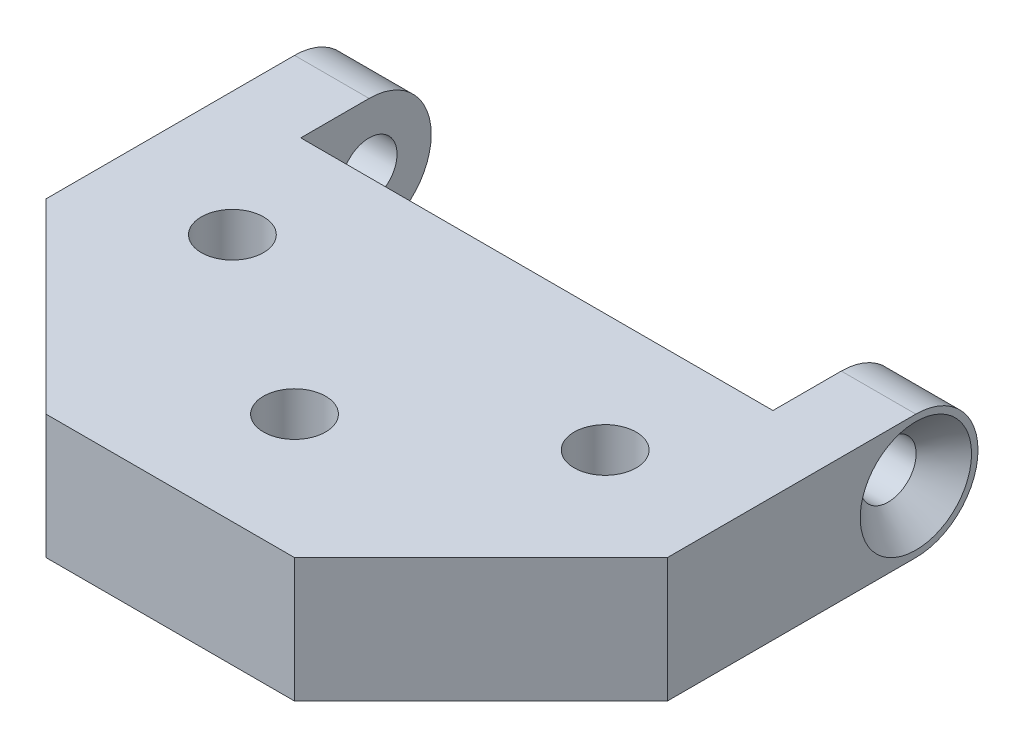
ISO-10303-21;
HEADER;
FILE_DESCRIPTION(('STEP AP214'),'2;1');
FILE_NAME('part.step','',(''),(''),'','','');
FILE_SCHEMA(('AUTOMOTIVE_DESIGN { 1 0 10303 214 1 1 1 1 }'));
ENDSEC;
DATA;
#1=APPLICATION_CONTEXT('core data for automotive mechanical design processes');
#2=APPLICATION_PROTOCOL_DEFINITION('international standard','automotive_design',2000,#1);
#3=PRODUCT_CONTEXT('',#1,'mechanical');
#4=PRODUCT('Part','Part','',(#3));
#5=PRODUCT_RELATED_PRODUCT_CATEGORY('part','',(#4));
#6=PRODUCT_DEFINITION_FORMATION('','',#4);
#7=PRODUCT_DEFINITION_CONTEXT('part definition',#1,'design');
#8=PRODUCT_DEFINITION('design','',#6,#7);
#9=PRODUCT_DEFINITION_SHAPE('','',#8);
#10=(LENGTH_UNIT() NAMED_UNIT(*) SI_UNIT(.MILLI.,.METRE.));
#11=(NAMED_UNIT(*) PLANE_ANGLE_UNIT() SI_UNIT($,.RADIAN.));
#12=(NAMED_UNIT(*) SI_UNIT($,.STERADIAN.) SOLID_ANGLE_UNIT());
#13=UNCERTAINTY_MEASURE_WITH_UNIT(LENGTH_MEASURE(1.E-05),#10,'distance_accuracy_value','');
#14=(GEOMETRIC_REPRESENTATION_CONTEXT(3) GLOBAL_UNCERTAINTY_ASSIGNED_CONTEXT((#13)) GLOBAL_UNIT_ASSIGNED_CONTEXT((#10,
#11,#12)) REPRESENTATION_CONTEXT('',''));
#15=CARTESIAN_POINT('',(0.,0.,0.));
#16=DIRECTION('',(0.,0.,1.));
#17=DIRECTION('',(1.,0.,0.));
#18=AXIS2_PLACEMENT_3D('',#15,#16,#17);
#19=CARTESIAN_POINT('',(19.,10.,0.));
#20=DIRECTION('',(-1.,0.,0.));
#21=DIRECTION('',(0.,0.,1.));
#22=AXIS2_PLACEMENT_3D('',#19,#20,#21);
#23=PLANE('',#22);
#24=CARTESIAN_POINT('',(19.,5.,-15.));
#25=DIRECTION('',(-1.,0.,0.));
#26=DIRECTION('',(0.,0.,1.));
#27=AXIS2_PLACEMENT_3D('',#24,#25,#26);
#28=CIRCLE('',#27,2.24999999999999);
#29=CARTESIAN_POINT('',(19.,5.,-12.75));
#30=VERTEX_POINT('',#29);
#31=EDGE_CURVE('E243',#30,#30,#28,.T.);
#32=ORIENTED_EDGE('',*,*,#31,.F.);
#33=EDGE_LOOP('',(#32));
#34=FACE_BOUND('',#33,.T.);
#35=DIRECTION('',(0.,0.,-1.));
#36=VECTOR('',#35,1.);
#37=CARTESIAN_POINT('',(19.,10.,0.));
#38=LINE('',#37,#36);
#39=CARTESIAN_POINT('',(19.,10.,-9.5));
#40=VERTEX_POINT('',#39);
#41=CARTESIAN_POINT('',(19.,10.,-15.));
#42=VERTEX_POINT('',#41);
#43=EDGE_CURVE('E136',#40,#42,#38,.T.);
#44=ORIENTED_EDGE('',*,*,#43,.T.);
#45=CARTESIAN_POINT('',(19.,5.,-15.));
#46=DIRECTION('',(-1.,0.,0.));
#47=DIRECTION('',(0.,0.,1.));
#48=AXIS2_PLACEMENT_3D('',#45,#46,#47);
#49=CIRCLE('',#48,5.);
#50=CARTESIAN_POINT('',(19.,5.,-20.));
#51=VERTEX_POINT('',#50);
#52=EDGE_CURVE('E211',#42,#51,#49,.T.);
#53=ORIENTED_EDGE('',*,*,#52,.T.);
#54=CARTESIAN_POINT('',(19.,5.,-15.));
#55=DIRECTION('',(-1.,0.,0.));
#56=DIRECTION('',(0.,0.,1.));
#57=AXIS2_PLACEMENT_3D('',#54,#55,#56);
#58=CIRCLE('',#57,5.);
#59=CARTESIAN_POINT('',(19.,0.,-15.));
#60=VERTEX_POINT('',#59);
#61=EDGE_CURVE('E208',#51,#60,#58,.T.);
#62=ORIENTED_EDGE('',*,*,#61,.T.);
#63=DIRECTION('',(0.,0.,-1.));
#64=VECTOR('',#63,1.);
#65=CARTESIAN_POINT('',(19.,0.,0.));
#66=LINE('',#65,#64);
#67=CARTESIAN_POINT('',(19.,0.,-9.5));
#68=VERTEX_POINT('',#67);
#69=EDGE_CURVE('E138',#68,#60,#66,.T.);
#70=ORIENTED_EDGE('',*,*,#69,.F.);
#71=DIRECTION('',(0.,-1.,0.));
#72=VECTOR('',#71,1.);
#73=CARTESIAN_POINT('',(19.,10.,-9.5));
#74=LINE('',#73,#72);
#75=EDGE_CURVE('E134',#40,#68,#74,.T.);
#76=ORIENTED_EDGE('',*,*,#75,.F.);
#77=EDGE_LOOP('',(#44,#53,#62,#70,#76));
#78=FACE_BOUND('',#77,.T.);
#79=ADVANCED_FACE('F41',(#34,#78),#23,.T.);
#80=CARTESIAN_POINT('',(0.,10.,-9.5));
#81=DIRECTION('',(0.,0.,-1.));
#82=DIRECTION('',(-1.,0.,0.));
#83=AXIS2_PLACEMENT_3D('',#80,#81,#82);
#84=PLANE('',#83);
#85=DIRECTION('',(1.,0.,0.));
#86=VECTOR('',#85,1.);
#87=CARTESIAN_POINT('',(0.,0.,-9.5));
#88=LINE('',#87,#86);
#89=CARTESIAN_POINT('',(-19.,0.,-9.5));
#90=VERTEX_POINT('',#89);
#91=EDGE_CURVE('E177',#90,#68,#88,.T.);
#92=ORIENTED_EDGE('',*,*,#91,.F.);
#93=DIRECTION('',(0.,-1.,0.));
#94=VECTOR('',#93,1.);
#95=CARTESIAN_POINT('',(-19.,10.,-9.5));
#96=LINE('',#95,#94);
#97=CARTESIAN_POINT('',(-19.,10.,-9.5));
#98=VERTEX_POINT('',#97);
#99=EDGE_CURVE('E145',#98,#90,#96,.T.);
#100=ORIENTED_EDGE('',*,*,#99,.F.);
#101=DIRECTION('',(1.,0.,0.));
#102=VECTOR('',#101,1.);
#103=CARTESIAN_POINT('',(0.,10.,-9.5));
#104=LINE('',#103,#102);
#105=EDGE_CURVE('E151',#98,#40,#104,.T.);
#106=ORIENTED_EDGE('',*,*,#105,.T.);
#107=ORIENTED_EDGE('',*,*,#75,.T.);
#108=EDGE_LOOP('',(#92,#100,#106,#107));
#109=FACE_BOUND('',#108,.T.);
#110=ADVANCED_FACE('F157',(#109),#84,.T.);
#111=CARTESIAN_POINT('',(-19.,10.,0.));
#112=DIRECTION('',(-1.,0.,0.));
#113=DIRECTION('',(0.,0.,1.));
#114=AXIS2_PLACEMENT_3D('',#111,#112,#113);
#115=PLANE('',#114);
#116=CARTESIAN_POINT('',(-19.,5.,-15.));
#117=DIRECTION('',(-1.,0.,0.));
#118=DIRECTION('',(0.,0.,1.));
#119=AXIS2_PLACEMENT_3D('',#116,#117,#118);
#120=CIRCLE('',#119,2.24999999999999);
#121=CARTESIAN_POINT('',(-19.,5.,-12.75));
#122=VERTEX_POINT('',#121);
#123=EDGE_CURVE('E248',#122,#122,#120,.T.);
#124=ORIENTED_EDGE('',*,*,#123,.T.);
#125=EDGE_LOOP('',(#124));
#126=FACE_BOUND('',#125,.T.);
#127=DIRECTION('',(0.,0.,-1.));
#128=VECTOR('',#127,1.);
#129=CARTESIAN_POINT('',(-19.,0.,0.));
#130=LINE('',#129,#128);
#131=CARTESIAN_POINT('',(-19.,0.,-15.));
#132=VERTEX_POINT('',#131);
#133=EDGE_CURVE('E181',#90,#132,#130,.T.);
#134=ORIENTED_EDGE('',*,*,#133,.T.);
#135=CARTESIAN_POINT('',(-19.,5.,-15.));
#136=DIRECTION('',(-1.,0.,0.));
#137=DIRECTION('',(0.,0.,1.));
#138=AXIS2_PLACEMENT_3D('',#135,#136,#137);
#139=CIRCLE('',#138,5.);
#140=CARTESIAN_POINT('',(-19.,5.,-20.));
#141=VERTEX_POINT('',#140);
#142=EDGE_CURVE('E225',#132,#141,#139,.F.);
#143=ORIENTED_EDGE('',*,*,#142,.T.);
#144=CARTESIAN_POINT('',(-19.,5.,-15.));
#145=DIRECTION('',(-1.,0.,0.));
#146=DIRECTION('',(0.,0.,1.));
#147=AXIS2_PLACEMENT_3D('',#144,#145,#146);
#148=CIRCLE('',#147,5.);
#149=CARTESIAN_POINT('',(-19.,10.,-15.));
#150=VERTEX_POINT('',#149);
#151=EDGE_CURVE('E222',#141,#150,#148,.F.);
#152=ORIENTED_EDGE('',*,*,#151,.T.);
#153=DIRECTION('',(0.,0.,-1.));
#154=VECTOR('',#153,1.);
#155=CARTESIAN_POINT('',(-19.,10.,0.));
#156=LINE('',#155,#154);
#157=EDGE_CURVE('E160',#98,#150,#156,.T.);
#158=ORIENTED_EDGE('',*,*,#157,.F.);
#159=ORIENTED_EDGE('',*,*,#99,.T.);
#160=EDGE_LOOP('',(#134,#143,#152,#158,#159));
#161=FACE_BOUND('',#160,.T.);
#162=ADVANCED_FACE('F290',(#126,#161),#115,.F.);
#163=CARTESIAN_POINT('',(-25.,10.,0.));
#164=DIRECTION('',(-1.,0.,0.));
#165=DIRECTION('',(0.,0.,1.));
#166=AXIS2_PLACEMENT_3D('',#163,#164,#165);
#167=PLANE('',#166);
#168=CARTESIAN_POINT('',(-25.,5.,-15.));
#169=DIRECTION('',(-1.,0.,0.));
#170=DIRECTION('',(0.,0.,1.));
#171=AXIS2_PLACEMENT_3D('',#168,#169,#170);
#172=CIRCLE('',#171,4.48);
#173=CARTESIAN_POINT('',(-25.,5.,-10.52));
#174=VERTEX_POINT('',#173);
#175=EDGE_CURVE('E566',#174,#174,#172,.T.);
#176=ORIENTED_EDGE('',*,*,#175,.F.);
#177=EDGE_LOOP('',(#176));
#178=FACE_BOUND('',#177,.T.);
#179=DIRECTION('',(0.,0.,-1.));
#180=VECTOR('',#179,1.);
#181=CARTESIAN_POINT('',(-25.,0.,0.));
#182=LINE('',#181,#180);
#183=CARTESIAN_POINT('',(-25.,0.,4.99999999999993));
#184=VERTEX_POINT('',#183);
#185=CARTESIAN_POINT('',(-25.,0.,-15.));
#186=VERTEX_POINT('',#185);
#187=EDGE_CURVE('E185',#184,#186,#182,.T.);
#188=ORIENTED_EDGE('',*,*,#187,.F.);
#189=DIRECTION('',(0.,1.,0.));
#190=VECTOR('',#189,1.);
#191=CARTESIAN_POINT('',(-25.,10.,4.99999999999993));
#192=LINE('',#191,#190);
#193=CARTESIAN_POINT('',(-25.,10.,4.99999999999993));
#194=VERTEX_POINT('',#193);
#195=EDGE_CURVE('E66',#184,#194,#192,.T.);
#196=ORIENTED_EDGE('',*,*,#195,.T.);
#197=DIRECTION('',(0.,0.,-1.));
#198=VECTOR('',#197,1.);
#199=CARTESIAN_POINT('',(-25.,10.,0.));
#200=LINE('',#199,#198);
#201=CARTESIAN_POINT('',(-25.,10.,-15.));
#202=VERTEX_POINT('',#201);
#203=EDGE_CURVE('E163',#194,#202,#200,.T.);
#204=ORIENTED_EDGE('',*,*,#203,.T.);
#205=CARTESIAN_POINT('',(-25.,5.,-15.));
#206=DIRECTION('',(-1.,0.,0.));
#207=DIRECTION('',(0.,0.,1.));
#208=AXIS2_PLACEMENT_3D('',#205,#206,#207);
#209=CIRCLE('',#208,5.);
#210=CARTESIAN_POINT('',(-25.,5.,-20.));
#211=VERTEX_POINT('',#210);
#212=EDGE_CURVE('E228',#202,#211,#209,.T.);
#213=ORIENTED_EDGE('',*,*,#212,.T.);
#214=CARTESIAN_POINT('',(-25.,5.,-15.));
#215=DIRECTION('',(-1.,0.,0.));
#216=DIRECTION('',(0.,0.,1.));
#217=AXIS2_PLACEMENT_3D('',#214,#215,#216);
#218=CIRCLE('',#217,5.);
#219=EDGE_CURVE('E231',#211,#186,#218,.T.);
#220=ORIENTED_EDGE('',*,*,#219,.T.);
#221=EDGE_LOOP('',(#188,#196,#204,#213,#220));
#222=FACE_BOUND('',#221,.T.);
#223=ADVANCED_FACE('F281',(#178,#222),#167,.T.);
#224=CARTESIAN_POINT('',(0.,10.,20.));
#225=DIRECTION('',(0.,0.,-1.));
#226=DIRECTION('',(-1.,0.,0.));
#227=AXIS2_PLACEMENT_3D('',#224,#225,#226);
#228=PLANE('',#227);
#229=DIRECTION('',(1.,0.,0.));
#230=VECTOR('',#229,1.);
#231=CARTESIAN_POINT('',(0.,10.,20.));
#232=LINE('',#231,#230);
#233=CARTESIAN_POINT('',(-9.99999999999999,10.,20.));
#234=VERTEX_POINT('',#233);
#235=CARTESIAN_POINT('',(9.99999999999995,10.,20.));
#236=VERTEX_POINT('',#235);
#237=EDGE_CURVE('E169',#234,#236,#232,.T.);
#238=ORIENTED_EDGE('',*,*,#237,.F.);
#239=DIRECTION('',(0.,-1.,0.));
#240=VECTOR('',#239,1.);
#241=CARTESIAN_POINT('',(-9.99999999999999,0.,20.));
#242=LINE('',#241,#240);
#243=CARTESIAN_POINT('',(-9.99999999999999,0.,20.));
#244=VERTEX_POINT('',#243);
#245=EDGE_CURVE('E256',#234,#244,#242,.T.);
#246=ORIENTED_EDGE('',*,*,#245,.T.);
#247=DIRECTION('',(1.,0.,0.));
#248=VECTOR('',#247,1.);
#249=CARTESIAN_POINT('',(0.,0.,20.));
#250=LINE('',#249,#248);
#251=CARTESIAN_POINT('',(9.99999999999995,0.,20.));
#252=VERTEX_POINT('',#251);
#253=EDGE_CURVE('E188',#244,#252,#250,.T.);
#254=ORIENTED_EDGE('',*,*,#253,.T.);
#255=DIRECTION('',(0.,1.,0.));
#256=VECTOR('',#255,1.);
#257=CARTESIAN_POINT('',(9.99999999999995,10.,20.));
#258=LINE('',#257,#256);
#259=EDGE_CURVE('E235',#252,#236,#258,.T.);
#260=ORIENTED_EDGE('',*,*,#259,.T.);
#261=EDGE_LOOP('',(#238,#246,#254,#260));
#262=FACE_BOUND('',#261,.T.);
#263=ADVANCED_FACE('F275',(#262),#228,.F.);
#264=CARTESIAN_POINT('',(25.,10.,0.));
#265=DIRECTION('',(-1.,0.,0.));
#266=DIRECTION('',(0.,0.,1.));
#267=AXIS2_PLACEMENT_3D('',#264,#265,#266);
#268=PLANE('',#267);
#269=CARTESIAN_POINT('',(25.,5.,-15.));
#270=DIRECTION('',(1.,0.,0.));
#271=DIRECTION('',(0.,0.,-1.));
#272=AXIS2_PLACEMENT_3D('',#269,#270,#271);
#273=CIRCLE('',#272,4.48);
#274=CARTESIAN_POINT('',(25.,5.,-19.48));
#275=VERTEX_POINT('',#274);
#276=EDGE_CURVE('E252',#275,#275,#273,.T.);
#277=ORIENTED_EDGE('',*,*,#276,.F.);
#278=EDGE_LOOP('',(#277));
#279=FACE_BOUND('',#278,.T.);
#280=DIRECTION('',(0.,0.,-1.));
#281=VECTOR('',#280,1.);
#282=CARTESIAN_POINT('',(25.,10.,0.));
#283=LINE('',#282,#281);
#284=CARTESIAN_POINT('',(25.,10.,5.));
#285=VERTEX_POINT('',#284);
#286=CARTESIAN_POINT('',(25.,10.,-15.));
#287=VERTEX_POINT('',#286);
#288=EDGE_CURVE('E172',#285,#287,#283,.T.);
#289=ORIENTED_EDGE('',*,*,#288,.F.);
#290=DIRECTION('',(0.,-1.,0.));
#291=VECTOR('',#290,1.);
#292=CARTESIAN_POINT('',(25.,10.,5.));
#293=LINE('',#292,#291);
#294=CARTESIAN_POINT('',(25.,0.,5.));
#295=VERTEX_POINT('',#294);
#296=EDGE_CURVE('E11',#285,#295,#293,.T.);
#297=ORIENTED_EDGE('',*,*,#296,.T.);
#298=DIRECTION('',(0.,0.,-1.));
#299=VECTOR('',#298,1.);
#300=CARTESIAN_POINT('',(25.,0.,0.));
#301=LINE('',#300,#299);
#302=CARTESIAN_POINT('',(25.,0.,-15.));
#303=VERTEX_POINT('',#302);
#304=EDGE_CURVE('E155',#295,#303,#301,.T.);
#305=ORIENTED_EDGE('',*,*,#304,.T.);
#306=CARTESIAN_POINT('',(25.,5.,-15.));
#307=DIRECTION('',(-1.,0.,0.));
#308=DIRECTION('',(0.,0.,1.));
#309=AXIS2_PLACEMENT_3D('',#306,#307,#308);
#310=CIRCLE('',#309,5.);
#311=CARTESIAN_POINT('',(25.,5.,-20.));
#312=VERTEX_POINT('',#311);
#313=EDGE_CURVE('E144',#303,#312,#310,.F.);
#314=ORIENTED_EDGE('',*,*,#313,.T.);
#315=CARTESIAN_POINT('',(25.,5.,-15.));
#316=DIRECTION('',(-1.,0.,0.));
#317=DIRECTION('',(0.,0.,1.));
#318=AXIS2_PLACEMENT_3D('',#315,#316,#317);
#319=CIRCLE('',#318,5.);
#320=EDGE_CURVE('E198',#312,#287,#319,.F.);
#321=ORIENTED_EDGE('',*,*,#320,.T.);
#322=EDGE_LOOP('',(#289,#297,#305,#314,#321));
#323=FACE_BOUND('',#322,.T.);
#324=ADVANCED_FACE('F330',(#279,#323),#268,.F.);
#325=CARTESIAN_POINT('',(0.,10.,0.));
#326=DIRECTION('',(0.,1.,0.));
#327=DIRECTION('',(0.,0.,1.));
#328=AXIS2_PLACEMENT_3D('',#325,#326,#327);
#329=PLANE('',#328);
#330=CARTESIAN_POINT('',(-15.,10.,0.));
#331=DIRECTION('',(0.,1.,0.));
#332=DIRECTION('',(0.,0.,1.));
#333=AXIS2_PLACEMENT_3D('',#330,#331,#332);
#334=CIRCLE('',#333,2.5);
#335=CARTESIAN_POINT('',(-15.,10.,2.5));
#336=VERTEX_POINT('',#335);
#337=EDGE_CURVE('E627',#336,#336,#334,.T.);
#338=ORIENTED_EDGE('',*,*,#337,.F.);
#339=EDGE_LOOP('',(#338));
#340=FACE_BOUND('',#339,.T.);
#341=CARTESIAN_POINT('',(15.,10.,0.));
#342=DIRECTION('',(0.,1.,0.));
#343=DIRECTION('',(0.,0.,1.));
#344=AXIS2_PLACEMENT_3D('',#341,#342,#343);
#345=CIRCLE('',#344,2.5);
#346=CARTESIAN_POINT('',(15.,10.,2.49999999999999));
#347=VERTEX_POINT('',#346);
#348=EDGE_CURVE('E611',#347,#347,#345,.T.);
#349=ORIENTED_EDGE('',*,*,#348,.F.);
#350=EDGE_LOOP('',(#349));
#351=FACE_BOUND('',#350,.T.);
#352=CARTESIAN_POINT('',(0.,10.,10.));
#353=DIRECTION('',(0.,1.,0.));
#354=DIRECTION('',(0.,0.,1.));
#355=AXIS2_PLACEMENT_3D('',#352,#353,#354);
#356=CIRCLE('',#355,2.5);
#357=CARTESIAN_POINT('',(0.,10.,12.5));
#358=VERTEX_POINT('',#357);
#359=EDGE_CURVE('E595',#358,#358,#356,.T.);
#360=ORIENTED_EDGE('',*,*,#359,.F.);
#361=EDGE_LOOP('',(#360));
#362=FACE_BOUND('',#361,.T.);
#363=ORIENTED_EDGE('',*,*,#203,.F.);
#364=DIRECTION('',(0.707106781186546,0.,0.707106781186549));
#365=VECTOR('',#364,1.);
#366=CARTESIAN_POINT('',(-15.,10.,15.));
#367=LINE('',#366,#365);
#368=EDGE_CURVE('E51',#194,#234,#367,.T.);
#369=ORIENTED_EDGE('',*,*,#368,.T.);
#370=ORIENTED_EDGE('',*,*,#237,.T.);
#371=DIRECTION('',(-0.707106781186549,0.,0.707106781186546));
#372=VECTOR('',#371,1.);
#373=CARTESIAN_POINT('',(15.,10.,15.));
#374=LINE('',#373,#372);
#375=EDGE_CURVE('E58',#236,#285,#374,.F.);
#376=ORIENTED_EDGE('',*,*,#375,.T.);
#377=ORIENTED_EDGE('',*,*,#288,.T.);
#378=DIRECTION('',(1.,0.,0.));
#379=VECTOR('',#378,1.);
#380=CARTESIAN_POINT('',(0.,10.,-15.));
#381=LINE('',#380,#379);
#382=EDGE_CURVE('E153',#287,#42,#381,.F.);
#383=ORIENTED_EDGE('',*,*,#382,.T.);
#384=ORIENTED_EDGE('',*,*,#43,.F.);
#385=ORIENTED_EDGE('',*,*,#105,.F.);
#386=ORIENTED_EDGE('',*,*,#157,.T.);
#387=DIRECTION('',(1.,0.,0.));
#388=VECTOR('',#387,1.);
#389=CARTESIAN_POINT('',(0.,10.,-15.));
#390=LINE('',#389,#388);
#391=EDGE_CURVE('E202',#150,#202,#390,.F.);
#392=ORIENTED_EDGE('',*,*,#391,.T.);
#393=EDGE_LOOP('',(#363,#369,#370,#376,#377,#383,#384,#385,#386,#392));
#394=FACE_BOUND('',#393,.T.);
#395=ADVANCED_FACE('F149',(#340,#351,#362,#394),#329,.T.);
#396=CARTESIAN_POINT('',(0.,0.,0.));
#397=DIRECTION('',(0.,1.,0.));
#398=DIRECTION('',(0.,0.,1.));
#399=AXIS2_PLACEMENT_3D('',#396,#397,#398);
#400=PLANE('',#399);
#401=CARTESIAN_POINT('',(-15.,0.,0.));
#402=DIRECTION('',(0.,1.,0.));
#403=DIRECTION('',(0.,0.,1.));
#404=AXIS2_PLACEMENT_3D('',#401,#402,#403);
#405=CIRCLE('',#404,2.25);
#406=CARTESIAN_POINT('',(-15.,0.,2.25));
#407=VERTEX_POINT('',#406);
#408=EDGE_CURVE('E615',#407,#407,#405,.T.);
#409=ORIENTED_EDGE('',*,*,#408,.T.);
#410=EDGE_LOOP('',(#409));
#411=FACE_BOUND('',#410,.T.);
#412=CARTESIAN_POINT('',(15.,0.,0.));
#413=DIRECTION('',(0.,1.,0.));
#414=DIRECTION('',(0.,0.,1.));
#415=AXIS2_PLACEMENT_3D('',#412,#413,#414);
#416=CIRCLE('',#415,2.25);
#417=CARTESIAN_POINT('',(15.,0.,2.24999999999999));
#418=VERTEX_POINT('',#417);
#419=EDGE_CURVE('E599',#418,#418,#416,.T.);
#420=ORIENTED_EDGE('',*,*,#419,.T.);
#421=EDGE_LOOP('',(#420));
#422=FACE_BOUND('',#421,.T.);
#423=CARTESIAN_POINT('',(0.,0.,10.));
#424=DIRECTION('',(0.,1.,0.));
#425=DIRECTION('',(0.,0.,1.));
#426=AXIS2_PLACEMENT_3D('',#423,#424,#425);
#427=CIRCLE('',#426,2.25);
#428=CARTESIAN_POINT('',(0.,0.,12.25));
#429=VERTEX_POINT('',#428);
#430=EDGE_CURVE('E569',#429,#429,#427,.T.);
#431=ORIENTED_EDGE('',*,*,#430,.T.);
#432=EDGE_LOOP('',(#431));
#433=FACE_BOUND('',#432,.T.);
#434=ORIENTED_EDGE('',*,*,#253,.F.);
#435=DIRECTION('',(-0.707106781186546,0.,-0.707106781186549));
#436=VECTOR('',#435,1.);
#437=CARTESIAN_POINT('',(-9.99999999999999,0.,20.));
#438=LINE('',#437,#436);
#439=EDGE_CURVE('E263',#244,#184,#438,.T.);
#440=ORIENTED_EDGE('',*,*,#439,.T.);
#441=ORIENTED_EDGE('',*,*,#187,.T.);
#442=DIRECTION('',(1.,0.,0.));
#443=VECTOR('',#442,1.);
#444=CARTESIAN_POINT('',(-19.,0.,-15.));
#445=LINE('',#444,#443);
#446=EDGE_CURVE('E214',#186,#132,#445,.T.);
#447=ORIENTED_EDGE('',*,*,#446,.T.);
#448=ORIENTED_EDGE('',*,*,#133,.F.);
#449=ORIENTED_EDGE('',*,*,#91,.T.);
#450=ORIENTED_EDGE('',*,*,#69,.T.);
#451=DIRECTION('',(1.,0.,0.));
#452=VECTOR('',#451,1.);
#453=CARTESIAN_POINT('',(25.,0.,-15.));
#454=LINE('',#453,#452);
#455=EDGE_CURVE('E218',#60,#303,#454,.T.);
#456=ORIENTED_EDGE('',*,*,#455,.T.);
#457=ORIENTED_EDGE('',*,*,#304,.F.);
#458=DIRECTION('',(0.707106781186549,0.,-0.707106781186546));
#459=VECTOR('',#458,1.);
#460=CARTESIAN_POINT('',(25.,0.,5.));
#461=LINE('',#460,#459);
#462=EDGE_CURVE('E260',#295,#252,#461,.F.);
#463=ORIENTED_EDGE('',*,*,#462,.T.);
#464=EDGE_LOOP('',(#434,#440,#441,#447,#448,#449,#450,#456,#457,#463));
#465=FACE_BOUND('',#464,.T.);
#466=ADVANCED_FACE('F280',(#411,#422,#433,#465),#400,.F.);
#467=CARTESIAN_POINT('',(0.,5.,-15.));
#468=DIRECTION('',(-1.,0.,0.));
#469=DIRECTION('',(0.,0.,1.));
#470=AXIS2_PLACEMENT_3D('',#467,#468,#469);
#471=CYLINDRICAL_SURFACE('',#470,5.);
#472=ORIENTED_EDGE('',*,*,#455,.F.);
#473=ORIENTED_EDGE('',*,*,#61,.F.);
#474=DIRECTION('',(1.,0.,0.));
#475=VECTOR('',#474,1.);
#476=CARTESIAN_POINT('',(19.,5.,-20.));
#477=LINE('',#476,#475);
#478=EDGE_CURVE('E178',#312,#51,#477,.F.);
#479=ORIENTED_EDGE('',*,*,#478,.F.);
#480=ORIENTED_EDGE('',*,*,#313,.F.);
#481=EDGE_LOOP('',(#472,#473,#479,#480));
#482=FACE_BOUND('',#481,.T.);
#483=ADVANCED_FACE('F304',(#482),#471,.T.);
#484=CARTESIAN_POINT('',(0.,5.,-15.));
#485=DIRECTION('',(1.,0.,0.));
#486=DIRECTION('',(0.,0.,-1.));
#487=AXIS2_PLACEMENT_3D('',#484,#485,#486);
#488=CYLINDRICAL_SURFACE('',#487,5.);
#489=ORIENTED_EDGE('',*,*,#52,.F.);
#490=ORIENTED_EDGE('',*,*,#382,.F.);
#491=ORIENTED_EDGE('',*,*,#320,.F.);
#492=ORIENTED_EDGE('',*,*,#478,.T.);
#493=EDGE_LOOP('',(#489,#490,#491,#492));
#494=FACE_BOUND('',#493,.T.);
#495=ADVANCED_FACE('F296',(#494),#488,.T.);
#496=CARTESIAN_POINT('',(0.,5.,-15.));
#497=DIRECTION('',(1.,0.,0.));
#498=DIRECTION('',(0.,0.,-1.));
#499=AXIS2_PLACEMENT_3D('',#496,#497,#498);
#500=CYLINDRICAL_SURFACE('',#499,5.);
#501=DIRECTION('',(1.,0.,0.));
#502=VECTOR('',#501,1.);
#503=CARTESIAN_POINT('',(0.,5.,-20.));
#504=LINE('',#503,#502);
#505=EDGE_CURVE('E239',#211,#141,#504,.T.);
#506=ORIENTED_EDGE('',*,*,#505,.F.);
#507=ORIENTED_EDGE('',*,*,#212,.F.);
#508=ORIENTED_EDGE('',*,*,#391,.F.);
#509=ORIENTED_EDGE('',*,*,#151,.F.);
#510=EDGE_LOOP('',(#506,#507,#508,#509));
#511=FACE_BOUND('',#510,.T.);
#512=ADVANCED_FACE('F294',(#511),#500,.T.);
#513=CARTESIAN_POINT('',(0.,5.,-15.));
#514=DIRECTION('',(-1.,0.,0.));
#515=DIRECTION('',(0.,0.,1.));
#516=AXIS2_PLACEMENT_3D('',#513,#514,#515);
#517=CYLINDRICAL_SURFACE('',#516,5.);
#518=ORIENTED_EDGE('',*,*,#219,.F.);
#519=ORIENTED_EDGE('',*,*,#505,.T.);
#520=ORIENTED_EDGE('',*,*,#142,.F.);
#521=ORIENTED_EDGE('',*,*,#446,.F.);
#522=EDGE_LOOP('',(#518,#519,#520,#521));
#523=FACE_BOUND('',#522,.T.);
#524=ADVANCED_FACE('F287',(#523),#517,.T.);
#525=CARTESIAN_POINT('',(25.,5.,-15.));
#526=DIRECTION('',(1.,0.,0.));
#527=DIRECTION('',(0.,0.,-1.));
#528=AXIS2_PLACEMENT_3D('',#525,#526,#527);
#529=CYLINDRICAL_SURFACE('',#528,2.24999999999999);
#530=ORIENTED_EDGE('',*,*,#31,.T.);
#531=EDGE_LOOP('',(#530));
#532=FACE_BOUND('',#531,.T.);
#533=CARTESIAN_POINT('',(22.77,5.,-15.));
#534=DIRECTION('',(1.,0.,0.));
#535=DIRECTION('',(0.,0.,-1.));
#536=AXIS2_PLACEMENT_3D('',#533,#534,#535);
#537=CIRCLE('',#536,2.25);
#538=CARTESIAN_POINT('',(22.77,5.,-17.25));
#539=VERTEX_POINT('',#538);
#540=EDGE_CURVE('E247',#539,#539,#537,.T.);
#541=ORIENTED_EDGE('',*,*,#540,.T.);
#542=EDGE_LOOP('',(#541));
#543=FACE_BOUND('',#542,.T.);
#544=ADVANCED_FACE('F302',(#532,#543),#529,.F.);
#545=CARTESIAN_POINT('',(25.,5.,-15.));
#546=DIRECTION('',(1.,0.,0.));
#547=DIRECTION('',(0.,0.,-1.));
#548=AXIS2_PLACEMENT_3D('',#545,#546,#547);
#549=CONICAL_SURFACE('',#548,4.48,0.785398163397448);
#550=ORIENTED_EDGE('',*,*,#540,.F.);
#551=EDGE_LOOP('',(#550));
#552=FACE_BOUND('',#551,.T.);
#553=ORIENTED_EDGE('',*,*,#276,.T.);
#554=EDGE_LOOP('',(#553));
#555=FACE_BOUND('',#554,.T.);
#556=ADVANCED_FACE('F392',(#552,#555),#549,.F.);
#557=CARTESIAN_POINT('',(-25.,5.,-15.));
#558=DIRECTION('',(-1.,0.,0.));
#559=DIRECTION('',(0.,0.,1.));
#560=AXIS2_PLACEMENT_3D('',#557,#558,#559);
#561=CYLINDRICAL_SURFACE('',#560,2.24999999999999);
#562=CARTESIAN_POINT('',(-22.77,5.,-15.));
#563=DIRECTION('',(-1.,0.,0.));
#564=DIRECTION('',(0.,0.,1.));
#565=AXIS2_PLACEMENT_3D('',#562,#563,#564);
#566=CIRCLE('',#565,2.25);
#567=CARTESIAN_POINT('',(-22.77,5.,-12.75));
#568=VERTEX_POINT('',#567);
#569=EDGE_CURVE('E253',#568,#568,#566,.T.);
#570=ORIENTED_EDGE('',*,*,#569,.T.);
#571=EDGE_LOOP('',(#570));
#572=FACE_BOUND('',#571,.T.);
#573=ORIENTED_EDGE('',*,*,#123,.F.);
#574=EDGE_LOOP('',(#573));
#575=FACE_BOUND('',#574,.T.);
#576=ADVANCED_FACE('F388',(#572,#575),#561,.F.);
#577=CARTESIAN_POINT('',(-25.,5.,-15.));
#578=DIRECTION('',(-1.,0.,0.));
#579=DIRECTION('',(0.,0.,1.));
#580=AXIS2_PLACEMENT_3D('',#577,#578,#579);
#581=CONICAL_SURFACE('',#580,4.48,0.785398163397448);
#582=ORIENTED_EDGE('',*,*,#569,.F.);
#583=EDGE_LOOP('',(#582));
#584=FACE_BOUND('',#583,.T.);
#585=ORIENTED_EDGE('',*,*,#175,.T.);
#586=EDGE_LOOP('',(#585));
#587=FACE_BOUND('',#586,.T.);
#588=ADVANCED_FACE('F384',(#584,#587),#581,.F.);
#589=CARTESIAN_POINT('',(0.,10.,10.));
#590=DIRECTION('',(0.,1.,0.));
#591=DIRECTION('',(0.,0.,1.));
#592=AXIS2_PLACEMENT_3D('',#589,#590,#591);
#593=CYLINDRICAL_SURFACE('',#592,2.25);
#594=ORIENTED_EDGE('',*,*,#430,.F.);
#595=EDGE_LOOP('',(#594));
#596=FACE_BOUND('',#595,.T.);
#597=CARTESIAN_POINT('',(0.,5.8,10.));
#598=DIRECTION('',(0.,1.,0.));
#599=DIRECTION('',(0.,0.,1.));
#600=AXIS2_PLACEMENT_3D('',#597,#598,#599);
#601=CIRCLE('',#600,2.25);
#602=CARTESIAN_POINT('',(0.,5.8,12.25));
#603=VERTEX_POINT('',#602);
#604=EDGE_CURVE('E576',#603,#603,#601,.T.);
#605=ORIENTED_EDGE('',*,*,#604,.T.);
#606=EDGE_LOOP('',(#605));
#607=FACE_BOUND('',#606,.T.);
#608=ADVANCED_FACE('F380',(#596,#607),#593,.F.);
#609=CARTESIAN_POINT('',(2.25,5.8,10.));
#610=DIRECTION('',(0.,-1.,0.));
#611=DIRECTION('',(0.,0.,-1.));
#612=AXIS2_PLACEMENT_3D('',#609,#610,#611);
#613=PLANE('',#612);
#614=ORIENTED_EDGE('',*,*,#604,.F.);
#615=EDGE_LOOP('',(#614));
#616=FACE_BOUND('',#615,.T.);
#617=CARTESIAN_POINT('',(0.,5.8,10.));
#618=DIRECTION('',(0.,1.,0.));
#619=DIRECTION('',(0.,0.,1.));
#620=AXIS2_PLACEMENT_3D('',#617,#618,#619);
#621=CIRCLE('',#620,2.5);
#622=CARTESIAN_POINT('',(0.,5.8,12.5));
#623=VERTEX_POINT('',#622);
#624=EDGE_CURVE('E591',#623,#623,#621,.T.);
#625=ORIENTED_EDGE('',*,*,#624,.T.);
#626=EDGE_LOOP('',(#625));
#627=FACE_BOUND('',#626,.T.);
#628=ADVANCED_FACE('F376',(#616,#627),#613,.F.);
#629=CARTESIAN_POINT('',(0.,10.,10.));
#630=DIRECTION('',(0.,1.,0.));
#631=DIRECTION('',(0.,0.,1.));
#632=AXIS2_PLACEMENT_3D('',#629,#630,#631);
#633=CYLINDRICAL_SURFACE('',#632,2.5);
#634=ORIENTED_EDGE('',*,*,#624,.F.);
#635=EDGE_LOOP('',(#634));
#636=FACE_BOUND('',#635,.T.);
#637=ORIENTED_EDGE('',*,*,#359,.T.);
#638=EDGE_LOOP('',(#637));
#639=FACE_BOUND('',#638,.T.);
#640=ADVANCED_FACE('F372',(#636,#639),#633,.F.);
#641=CARTESIAN_POINT('',(15.,10.,0.));
#642=DIRECTION('',(0.,1.,0.));
#643=DIRECTION('',(0.,0.,1.));
#644=AXIS2_PLACEMENT_3D('',#641,#642,#643);
#645=CYLINDRICAL_SURFACE('',#644,2.25);
#646=ORIENTED_EDGE('',*,*,#419,.F.);
#647=EDGE_LOOP('',(#646));
#648=FACE_BOUND('',#647,.T.);
#649=CARTESIAN_POINT('',(15.,5.8,0.));
#650=DIRECTION('',(0.,1.,0.));
#651=DIRECTION('',(0.,0.,1.));
#652=AXIS2_PLACEMENT_3D('',#649,#650,#651);
#653=CIRCLE('',#652,2.25);
#654=CARTESIAN_POINT('',(15.,5.8,2.24999999999999));
#655=VERTEX_POINT('',#654);
#656=EDGE_CURVE('E603',#655,#655,#653,.T.);
#657=ORIENTED_EDGE('',*,*,#656,.T.);
#658=EDGE_LOOP('',(#657));
#659=FACE_BOUND('',#658,.T.);
#660=ADVANCED_FACE('F368',(#648,#659),#645,.F.);
#661=CARTESIAN_POINT('',(17.25,5.8,0.));
#662=DIRECTION('',(0.,-1.,0.));
#663=DIRECTION('',(0.,0.,-1.));
#664=AXIS2_PLACEMENT_3D('',#661,#662,#663);
#665=PLANE('',#664);
#666=ORIENTED_EDGE('',*,*,#656,.F.);
#667=EDGE_LOOP('',(#666));
#668=FACE_BOUND('',#667,.T.);
#669=CARTESIAN_POINT('',(15.,5.8,0.));
#670=DIRECTION('',(0.,1.,0.));
#671=DIRECTION('',(0.,0.,1.));
#672=AXIS2_PLACEMENT_3D('',#669,#670,#671);
#673=CIRCLE('',#672,2.5);
#674=CARTESIAN_POINT('',(15.,5.8,2.49999999999999));
#675=VERTEX_POINT('',#674);
#676=EDGE_CURVE('E607',#675,#675,#673,.T.);
#677=ORIENTED_EDGE('',*,*,#676,.T.);
#678=EDGE_LOOP('',(#677));
#679=FACE_BOUND('',#678,.T.);
#680=ADVANCED_FACE('F364',(#668,#679),#665,.F.);
#681=CARTESIAN_POINT('',(15.,10.,0.));
#682=DIRECTION('',(0.,1.,0.));
#683=DIRECTION('',(0.,0.,1.));
#684=AXIS2_PLACEMENT_3D('',#681,#682,#683);
#685=CYLINDRICAL_SURFACE('',#684,2.5);
#686=ORIENTED_EDGE('',*,*,#676,.F.);
#687=EDGE_LOOP('',(#686));
#688=FACE_BOUND('',#687,.T.);
#689=ORIENTED_EDGE('',*,*,#348,.T.);
#690=EDGE_LOOP('',(#689));
#691=FACE_BOUND('',#690,.T.);
#692=ADVANCED_FACE('F360',(#688,#691),#685,.F.);
#693=CARTESIAN_POINT('',(-15.,10.,0.));
#694=DIRECTION('',(0.,1.,0.));
#695=DIRECTION('',(0.,0.,1.));
#696=AXIS2_PLACEMENT_3D('',#693,#694,#695);
#697=CYLINDRICAL_SURFACE('',#696,2.25);
#698=ORIENTED_EDGE('',*,*,#408,.F.);
#699=EDGE_LOOP('',(#698));
#700=FACE_BOUND('',#699,.T.);
#701=CARTESIAN_POINT('',(-15.,5.8,0.));
#702=DIRECTION('',(0.,1.,0.));
#703=DIRECTION('',(0.,0.,1.));
#704=AXIS2_PLACEMENT_3D('',#701,#702,#703);
#705=CIRCLE('',#704,2.25);
#706=CARTESIAN_POINT('',(-15.,5.8,2.25));
#707=VERTEX_POINT('',#706);
#708=EDGE_CURVE('E619',#707,#707,#705,.T.);
#709=ORIENTED_EDGE('',*,*,#708,.T.);
#710=EDGE_LOOP('',(#709));
#711=FACE_BOUND('',#710,.T.);
#712=ADVANCED_FACE('F352',(#700,#711),#697,.F.);
#713=CARTESIAN_POINT('',(-12.75,5.8,0.));
#714=DIRECTION('',(0.,-1.,0.));
#715=DIRECTION('',(0.,0.,-1.));
#716=AXIS2_PLACEMENT_3D('',#713,#714,#715);
#717=PLANE('',#716);
#718=ORIENTED_EDGE('',*,*,#708,.F.);
#719=EDGE_LOOP('',(#718));
#720=FACE_BOUND('',#719,.T.);
#721=CARTESIAN_POINT('',(-15.,5.8,0.));
#722=DIRECTION('',(0.,1.,0.));
#723=DIRECTION('',(0.,0.,1.));
#724=AXIS2_PLACEMENT_3D('',#721,#722,#723);
#725=CIRCLE('',#724,2.5);
#726=CARTESIAN_POINT('',(-15.,5.8,2.5));
#727=VERTEX_POINT('',#726);
#728=EDGE_CURVE('E623',#727,#727,#725,.T.);
#729=ORIENTED_EDGE('',*,*,#728,.T.);
#730=EDGE_LOOP('',(#729));
#731=FACE_BOUND('',#730,.T.);
#732=ADVANCED_FACE('F341',(#720,#731),#717,.F.);
#733=CARTESIAN_POINT('',(-15.,10.,0.));
#734=DIRECTION('',(0.,1.,0.));
#735=DIRECTION('',(0.,0.,1.));
#736=AXIS2_PLACEMENT_3D('',#733,#734,#735);
#737=CYLINDRICAL_SURFACE('',#736,2.5);
#738=ORIENTED_EDGE('',*,*,#728,.F.);
#739=EDGE_LOOP('',(#738));
#740=FACE_BOUND('',#739,.T.);
#741=ORIENTED_EDGE('',*,*,#337,.T.);
#742=EDGE_LOOP('',(#741));
#743=FACE_BOUND('',#742,.T.);
#744=ADVANCED_FACE('F337',(#740,#743),#737,.F.);
#745=CARTESIAN_POINT('',(-9.99999999999999,10.,20.));
#746=DIRECTION('',(-0.707106781186549,0.,0.707106781186546));
#747=DIRECTION('',(0.,1.,0.));
#748=AXIS2_PLACEMENT_3D('',#745,#746,#747);
#749=PLANE('',#748);
#750=ORIENTED_EDGE('',*,*,#368,.F.);
#751=ORIENTED_EDGE('',*,*,#195,.F.);
#752=ORIENTED_EDGE('',*,*,#439,.F.);
#753=ORIENTED_EDGE('',*,*,#245,.F.);
#754=EDGE_LOOP('',(#750,#751,#752,#753));
#755=FACE_BOUND('',#754,.T.);
#756=ADVANCED_FACE('F278',(#755),#749,.T.);
#757=CARTESIAN_POINT('',(25.,10.,5.));
#758=DIRECTION('',(-0.707106781186546,0.,-0.707106781186549));
#759=DIRECTION('',(0.,-1.,0.));
#760=AXIS2_PLACEMENT_3D('',#757,#758,#759);
#761=PLANE('',#760);
#762=ORIENTED_EDGE('',*,*,#375,.F.);
#763=ORIENTED_EDGE('',*,*,#259,.F.);
#764=ORIENTED_EDGE('',*,*,#462,.F.);
#765=ORIENTED_EDGE('',*,*,#296,.F.);
#766=EDGE_LOOP('',(#762,#763,#764,#765));
#767=FACE_BOUND('',#766,.T.);
#768=ADVANCED_FACE('F44',(#767),#761,.F.);
#769=CLOSED_SHELL('',(#79,#110,#162,#223,#263,#324,#395,#466,#483,#495,#512,#524,#544,#556,#576,
#588,#608,#628,#640,#660,#680,#692,#712,#732,#744,#756,#768));
#770=MANIFOLD_SOLID_BREP('B2',#769);
#771=ADVANCED_BREP_SHAPE_REPRESENTATION('',(#18,#770),#14);
#772=SHAPE_DEFINITION_REPRESENTATION(#9,#771);
ENDSEC;
END-ISO-10303-21;
